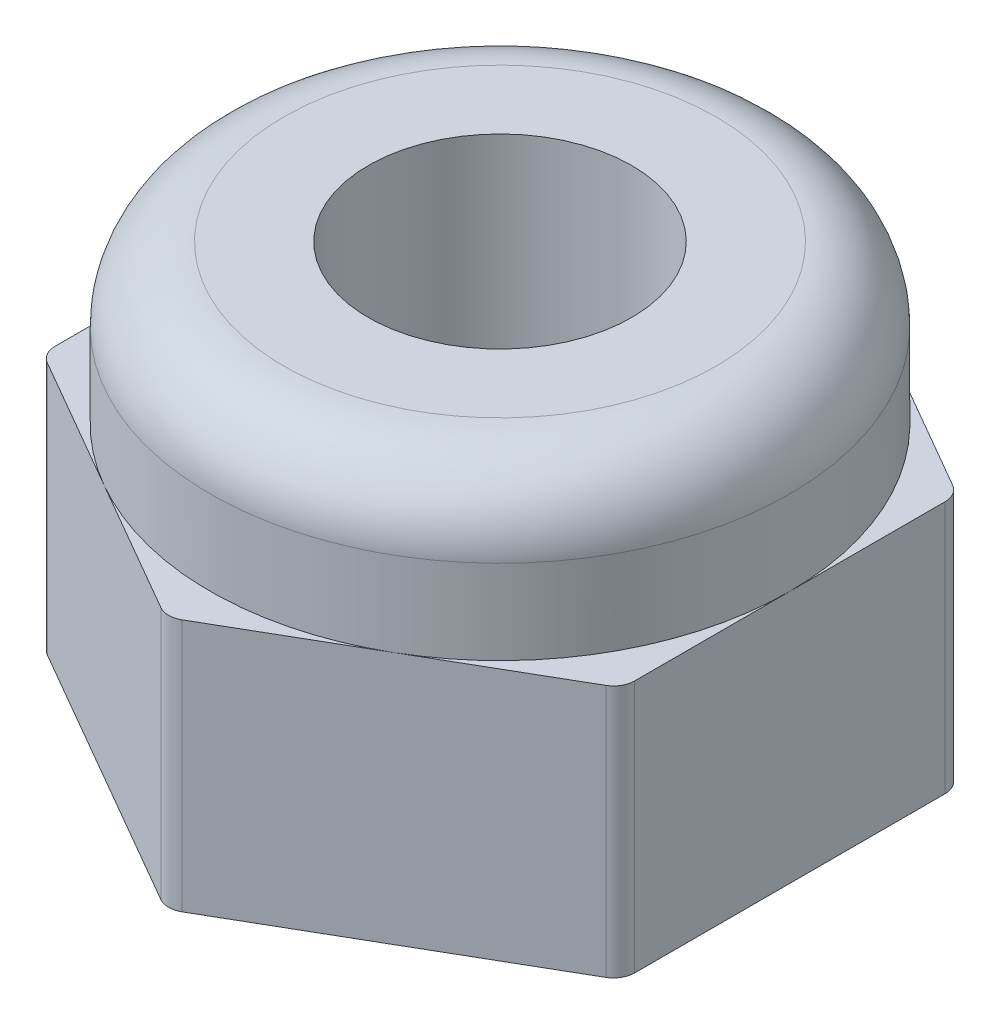
ISO-10303-21;
HEADER;
FILE_DESCRIPTION(('STEP AP214'),'2;1');
FILE_NAME('part.step','',(''),(''),'','','');
FILE_SCHEMA(('AUTOMOTIVE_DESIGN { 1 0 10303 214 1 1 1 1 }'));
ENDSEC;
DATA;
#1=APPLICATION_CONTEXT('core data for automotive mechanical design processes');
#2=APPLICATION_PROTOCOL_DEFINITION('international standard','automotive_design',2000,#1);
#3=PRODUCT_CONTEXT('',#1,'mechanical');
#4=PRODUCT('Part','Part','',(#3));
#5=PRODUCT_RELATED_PRODUCT_CATEGORY('part','',(#4));
#6=PRODUCT_DEFINITION_FORMATION('','',#4);
#7=PRODUCT_DEFINITION_CONTEXT('part definition',#1,'design');
#8=PRODUCT_DEFINITION('design','',#6,#7);
#9=PRODUCT_DEFINITION_SHAPE('','',#8);
#10=(LENGTH_UNIT() NAMED_UNIT(*) SI_UNIT(.MILLI.,.METRE.));
#11=(NAMED_UNIT(*) PLANE_ANGLE_UNIT() SI_UNIT($,.RADIAN.));
#12=(NAMED_UNIT(*) SI_UNIT($,.STERADIAN.) SOLID_ANGLE_UNIT());
#13=UNCERTAINTY_MEASURE_WITH_UNIT(LENGTH_MEASURE(1.E-05),#10,'distance_accuracy_value','');
#14=(GEOMETRIC_REPRESENTATION_CONTEXT(3) GLOBAL_UNCERTAINTY_ASSIGNED_CONTEXT((#13)) GLOBAL_UNIT_ASSIGNED_CONTEXT((#10,
#11,#12)) REPRESENTATION_CONTEXT('',''));
#15=CARTESIAN_POINT('',(0.,0.,0.));
#16=DIRECTION('',(0.,0.,1.));
#17=DIRECTION('',(1.,0.,0.));
#18=AXIS2_PLACEMENT_3D('',#15,#16,#17);
#19=CARTESIAN_POINT('',(0.,2.4,0.));
#20=DIRECTION('',(0.,1.,0.));
#21=DIRECTION('',(0.,0.,1.));
#22=AXIS2_PLACEMENT_3D('',#19,#20,#21);
#23=PLANE('',#22);
#24=DIRECTION('',(0.866025403784439,0.,-0.5));
#25=VECTOR('',#24,1.);
#26=CARTESIAN_POINT('',(0.,2.4,3.17542648054294));
#27=LINE('',#26,#25);
#28=CARTESIAN_POINT('',(1.375,2.4,2.38156986040721));
#29=VERTEX_POINT('',#28);
#30=CARTESIAN_POINT('',(2.65,2.4,1.64544826719043));
#31=VERTEX_POINT('',#30);
#32=EDGE_CURVE('E159',#29,#31,#27,.T.);
#33=ORIENTED_EDGE('',*,*,#32,.T.);
#34=CARTESIAN_POINT('',(2.55,2.4,1.47224318643355));
#35=DIRECTION('',(0.,1.,0.));
#36=DIRECTION('',(0.,0.,1.));
#37=AXIS2_PLACEMENT_3D('',#34,#35,#36);
#38=CIRCLE('',#37,0.2);
#39=CARTESIAN_POINT('',(2.75,2.4,1.47224318643355));
#40=VERTEX_POINT('',#39);
#41=EDGE_CURVE('E52',#31,#40,#38,.T.);
#42=ORIENTED_EDGE('',*,*,#41,.T.);
#43=DIRECTION('',(0.,0.,-1.));
#44=VECTOR('',#43,1.);
#45=CARTESIAN_POINT('',(2.75,2.4,1.58771324027147));
#46=LINE('',#45,#44);
#47=CARTESIAN_POINT('',(2.75,2.4,0.));
#48=VERTEX_POINT('',#47);
#49=EDGE_CURVE('E170',#40,#48,#46,.T.);
#50=ORIENTED_EDGE('',*,*,#49,.T.);
#51=CARTESIAN_POINT('',(0.,2.4,0.));
#52=DIRECTION('',(0.,1.,0.));
#53=DIRECTION('',(0.,0.,1.));
#54=AXIS2_PLACEMENT_3D('',#51,#52,#53);
#55=CIRCLE('',#54,2.75);
#56=EDGE_CURVE('E168',#29,#48,#55,.T.);
#57=ORIENTED_EDGE('',*,*,#56,.F.);
#58=EDGE_LOOP('',(#33,#42,#50,#57));
#59=FACE_BOUND('',#58,.T.);
#60=ADVANCED_FACE('F43',(#59),#23,.T.);
#61=CARTESIAN_POINT('',(2.75,2.4,-1.47224318643355));
#62=VERTEX_POINT('',#61);
#63=EDGE_CURVE('E158',#48,#62,#46,.T.);
#64=ORIENTED_EDGE('',*,*,#63,.T.);
#65=CARTESIAN_POINT('',(2.55,2.4,-1.47224318643355));
#66=DIRECTION('',(0.,1.,0.));
#67=DIRECTION('',(0.,0.,1.));
#68=AXIS2_PLACEMENT_3D('',#65,#66,#67);
#69=CIRCLE('',#68,0.2);
#70=CARTESIAN_POINT('',(2.65,2.4,-1.64544826719043));
#71=VERTEX_POINT('',#70);
#72=EDGE_CURVE('E302',#62,#71,#69,.T.);
#73=ORIENTED_EDGE('',*,*,#72,.T.);
#74=DIRECTION('',(-0.866025403784439,0.,-0.5));
#75=VECTOR('',#74,1.);
#76=CARTESIAN_POINT('',(2.75,2.4,-1.58771324027147));
#77=LINE('',#76,#75);
#78=CARTESIAN_POINT('',(1.375,2.4,-2.38156986040721));
#79=VERTEX_POINT('',#78);
#80=EDGE_CURVE('E193',#71,#79,#77,.T.);
#81=ORIENTED_EDGE('',*,*,#80,.T.);
#82=EDGE_CURVE('E176',#48,#79,#55,.T.);
#83=ORIENTED_EDGE('',*,*,#82,.F.);
#84=EDGE_LOOP('',(#64,#73,#81,#83));
#85=FACE_BOUND('',#84,.T.);
#86=ADVANCED_FACE('F366',(#85),#23,.T.);
#87=CARTESIAN_POINT('',(0.1,2.4,-3.11769145362398));
#88=VERTEX_POINT('',#87);
#89=EDGE_CURVE('E197',#79,#88,#77,.T.);
#90=ORIENTED_EDGE('',*,*,#89,.T.);
#91=CARTESIAN_POINT('',(0.,2.4,-2.94448637286709));
#92=DIRECTION('',(0.,1.,0.));
#93=DIRECTION('',(0.,0.,1.));
#94=AXIS2_PLACEMENT_3D('',#91,#92,#93);
#95=CIRCLE('',#94,0.2);
#96=CARTESIAN_POINT('',(-0.0999999999999989,2.4,-3.11769145362398));
#97=VERTEX_POINT('',#96);
#98=EDGE_CURVE('E292',#88,#97,#95,.T.);
#99=ORIENTED_EDGE('',*,*,#98,.T.);
#100=DIRECTION('',(-0.866025403784439,0.,0.5));
#101=VECTOR('',#100,1.);
#102=CARTESIAN_POINT('',(0.,2.4,-3.17542648054294));
#103=LINE('',#102,#101);
#104=CARTESIAN_POINT('',(-1.375,2.4,-2.38156986040721));
#105=VERTEX_POINT('',#104);
#106=EDGE_CURVE('E198',#97,#105,#103,.T.);
#107=ORIENTED_EDGE('',*,*,#106,.T.);
#108=EDGE_CURVE('E374',#79,#105,#55,.T.);
#109=ORIENTED_EDGE('',*,*,#108,.F.);
#110=EDGE_LOOP('',(#90,#99,#107,#109));
#111=FACE_BOUND('',#110,.T.);
#112=ADVANCED_FACE('F390',(#111),#23,.T.);
#113=CARTESIAN_POINT('',(-2.65,2.4,-1.64544826719043));
#114=VERTEX_POINT('',#113);
#115=EDGE_CURVE('E196',#105,#114,#103,.T.);
#116=ORIENTED_EDGE('',*,*,#115,.T.);
#117=CARTESIAN_POINT('',(-2.55,2.4,-1.47224318643355));
#118=DIRECTION('',(0.,1.,0.));
#119=DIRECTION('',(0.,0.,1.));
#120=AXIS2_PLACEMENT_3D('',#117,#118,#119);
#121=CIRCLE('',#120,0.2);
#122=CARTESIAN_POINT('',(-2.75,2.4,-1.47224318643355));
#123=VERTEX_POINT('',#122);
#124=EDGE_CURVE('E282',#114,#123,#121,.T.);
#125=ORIENTED_EDGE('',*,*,#124,.T.);
#126=DIRECTION('',(0.,0.,1.));
#127=VECTOR('',#126,1.);
#128=CARTESIAN_POINT('',(-2.75,2.4,-1.58771324027147));
#129=LINE('',#128,#127);
#130=CARTESIAN_POINT('',(-2.75,2.4,0.));
#131=VERTEX_POINT('',#130);
#132=EDGE_CURVE('E202',#123,#131,#129,.T.);
#133=ORIENTED_EDGE('',*,*,#132,.T.);
#134=EDGE_CURVE('E187',#105,#131,#55,.T.);
#135=ORIENTED_EDGE('',*,*,#134,.F.);
#136=EDGE_LOOP('',(#116,#125,#133,#135));
#137=FACE_BOUND('',#136,.T.);
#138=ADVANCED_FACE('F380',(#137),#23,.T.);
#139=CARTESIAN_POINT('',(-2.75,2.4,1.47224318643355));
#140=VERTEX_POINT('',#139);
#141=EDGE_CURVE('E201',#131,#140,#129,.T.);
#142=ORIENTED_EDGE('',*,*,#141,.T.);
#143=CARTESIAN_POINT('',(-2.55,2.4,1.47224318643355));
#144=DIRECTION('',(0.,1.,0.));
#145=DIRECTION('',(0.,0.,1.));
#146=AXIS2_PLACEMENT_3D('',#143,#144,#145);
#147=CIRCLE('',#146,0.2);
#148=CARTESIAN_POINT('',(-2.65,2.4,1.64544826719043));
#149=VERTEX_POINT('',#148);
#150=EDGE_CURVE('E272',#140,#149,#147,.T.);
#151=ORIENTED_EDGE('',*,*,#150,.T.);
#152=DIRECTION('',(0.866025403784439,0.,0.5));
#153=VECTOR('',#152,1.);
#154=CARTESIAN_POINT('',(-2.75,2.4,1.58771324027147));
#155=LINE('',#154,#153);
#156=CARTESIAN_POINT('',(-1.375,2.4,2.38156986040721));
#157=VERTEX_POINT('',#156);
#158=EDGE_CURVE('E166',#149,#157,#155,.T.);
#159=ORIENTED_EDGE('',*,*,#158,.T.);
#160=EDGE_CURVE('E182',#131,#157,#55,.T.);
#161=ORIENTED_EDGE('',*,*,#160,.F.);
#162=EDGE_LOOP('',(#142,#151,#159,#161));
#163=FACE_BOUND('',#162,.T.);
#164=ADVANCED_FACE('F382',(#163),#23,.T.);
#165=CARTESIAN_POINT('',(2.75,2.4,-1.58771324027147));
#166=DIRECTION('',(-0.5,0.,0.866025403784439));
#167=DIRECTION('',(0.866025403784439,0.,0.5));
#168=AXIS2_PLACEMENT_3D('',#165,#166,#167);
#169=PLANE('',#168);
#170=DIRECTION('',(-0.866025403784439,0.,-0.5));
#171=VECTOR('',#170,1.);
#172=CARTESIAN_POINT('',(2.75,0.,-1.58771324027147));
#173=LINE('',#172,#171);
#174=CARTESIAN_POINT('',(2.65,0.,-1.64544826719043));
#175=VERTEX_POINT('',#174);
#176=CARTESIAN_POINT('',(0.1,0.,-3.11769145362398));
#177=VERTEX_POINT('',#176);
#178=EDGE_CURVE('E175',#175,#177,#173,.T.);
#179=ORIENTED_EDGE('',*,*,#178,.T.);
#180=DIRECTION('',(0.,-1.,0.));
#181=VECTOR('',#180,1.);
#182=CARTESIAN_POINT('',(0.100000000000001,2.4,-3.11769145362398));
#183=LINE('',#182,#181);
#184=EDGE_CURVE('E289',#177,#88,#183,.F.);
#185=ORIENTED_EDGE('',*,*,#184,.T.);
#186=ORIENTED_EDGE('',*,*,#89,.F.);
#187=ORIENTED_EDGE('',*,*,#80,.F.);
#188=DIRECTION('',(0.,-1.,0.));
#189=VECTOR('',#188,1.);
#190=CARTESIAN_POINT('',(2.65,2.4,-1.64544826719043));
#191=LINE('',#190,#189);
#192=EDGE_CURVE('E285',#71,#175,#191,.T.);
#193=ORIENTED_EDGE('',*,*,#192,.T.);
#194=EDGE_LOOP('',(#179,#185,#186,#187,#193));
#195=FACE_BOUND('',#194,.T.);
#196=ADVANCED_FACE('F356',(#195),#169,.F.);
#197=CARTESIAN_POINT('',(0.,2.4,-3.17542648054294));
#198=DIRECTION('',(0.5,0.,0.866025403784439));
#199=DIRECTION('',(0.866025403784439,0.,-0.5));
#200=AXIS2_PLACEMENT_3D('',#197,#198,#199);
#201=PLANE('',#200);
#202=DIRECTION('',(-0.866025403784439,0.,0.5));
#203=VECTOR('',#202,1.);
#204=CARTESIAN_POINT('',(0.,0.,-3.17542648054294));
#205=LINE('',#204,#203);
#206=CARTESIAN_POINT('',(-0.0999999999999989,0.,-3.11769145362398));
#207=VERTEX_POINT('',#206);
#208=CARTESIAN_POINT('',(-2.65,0.,-1.64544826719043));
#209=VERTEX_POINT('',#208);
#210=EDGE_CURVE('E214',#207,#209,#205,.T.);
#211=ORIENTED_EDGE('',*,*,#210,.T.);
#212=DIRECTION('',(0.,-1.,0.));
#213=VECTOR('',#212,1.);
#214=CARTESIAN_POINT('',(-2.65,2.4,-1.64544826719043));
#215=LINE('',#214,#213);
#216=EDGE_CURVE('E279',#209,#114,#215,.F.);
#217=ORIENTED_EDGE('',*,*,#216,.T.);
#218=ORIENTED_EDGE('',*,*,#115,.F.);
#219=ORIENTED_EDGE('',*,*,#106,.F.);
#220=DIRECTION('',(0.,-1.,0.));
#221=VECTOR('',#220,1.);
#222=CARTESIAN_POINT('',(-0.0999999999999989,2.4,-3.11769145362398));
#223=LINE('',#222,#221);
#224=EDGE_CURVE('E275',#97,#207,#223,.T.);
#225=ORIENTED_EDGE('',*,*,#224,.T.);
#226=EDGE_LOOP('',(#211,#217,#218,#219,#225));
#227=FACE_BOUND('',#226,.T.);
#228=ADVANCED_FACE('F345',(#227),#201,.F.);
#229=CARTESIAN_POINT('',(-2.75,2.4,-1.58771324027147));
#230=DIRECTION('',(1.,0.,0.));
#231=DIRECTION('',(0.,0.,-1.));
#232=AXIS2_PLACEMENT_3D('',#229,#230,#231);
#233=PLANE('',#232);
#234=DIRECTION('',(0.,0.,1.));
#235=VECTOR('',#234,1.);
#236=CARTESIAN_POINT('',(-2.75,0.,-1.58771324027147));
#237=LINE('',#236,#235);
#238=CARTESIAN_POINT('',(-2.75,0.,-1.47224318643355));
#239=VERTEX_POINT('',#238);
#240=CARTESIAN_POINT('',(-2.75,0.,1.47224318643355));
#241=VERTEX_POINT('',#240);
#242=EDGE_CURVE('E218',#239,#241,#237,.T.);
#243=ORIENTED_EDGE('',*,*,#242,.T.);
#244=DIRECTION('',(0.,-1.,0.));
#245=VECTOR('',#244,1.);
#246=CARTESIAN_POINT('',(-2.75,2.4,1.47224318643355));
#247=LINE('',#246,#245);
#248=EDGE_CURVE('E269',#241,#140,#247,.F.);
#249=ORIENTED_EDGE('',*,*,#248,.T.);
#250=ORIENTED_EDGE('',*,*,#141,.F.);
#251=ORIENTED_EDGE('',*,*,#132,.F.);
#252=DIRECTION('',(0.,-1.,0.));
#253=VECTOR('',#252,1.);
#254=CARTESIAN_POINT('',(-2.75,2.4,-1.47224318643355));
#255=LINE('',#254,#253);
#256=EDGE_CURVE('E265',#123,#239,#255,.T.);
#257=ORIENTED_EDGE('',*,*,#256,.T.);
#258=EDGE_LOOP('',(#243,#249,#250,#251,#257));
#259=FACE_BOUND('',#258,.T.);
#260=ADVANCED_FACE('F334',(#259),#233,.F.);
#261=CARTESIAN_POINT('',(-2.75,2.4,1.58771324027147));
#262=DIRECTION('',(0.5,0.,-0.866025403784439));
#263=DIRECTION('',(-0.866025403784439,0.,-0.5));
#264=AXIS2_PLACEMENT_3D('',#261,#262,#263);
#265=PLANE('',#264);
#266=ORIENTED_EDGE('',*,*,#158,.F.);
#267=DIRECTION('',(0.,-1.,0.));
#268=VECTOR('',#267,1.);
#269=CARTESIAN_POINT('',(-2.65,2.4,1.64544826719043));
#270=LINE('',#269,#268);
#271=CARTESIAN_POINT('',(-2.65,0.,1.64544826719043));
#272=VERTEX_POINT('',#271);
#273=EDGE_CURVE('E243',#149,#272,#270,.T.);
#274=ORIENTED_EDGE('',*,*,#273,.T.);
#275=DIRECTION('',(0.866025403784439,0.,0.5));
#276=VECTOR('',#275,1.);
#277=CARTESIAN_POINT('',(-2.75,0.,1.58771324027147));
#278=LINE('',#277,#276);
#279=CARTESIAN_POINT('',(-0.100000000000001,0.,3.11769145362398));
#280=VERTEX_POINT('',#279);
#281=EDGE_CURVE('E222',#272,#280,#278,.T.);
#282=ORIENTED_EDGE('',*,*,#281,.T.);
#283=DIRECTION('',(0.,-1.,0.));
#284=VECTOR('',#283,1.);
#285=CARTESIAN_POINT('',(-0.100000000000001,2.4,3.11769145362398));
#286=LINE('',#285,#284);
#287=CARTESIAN_POINT('',(-0.100000000000001,2.4,3.11769145362398));
#288=VERTEX_POINT('',#287);
#289=EDGE_CURVE('E240',#280,#288,#286,.F.);
#290=ORIENTED_EDGE('',*,*,#289,.T.);
#291=EDGE_CURVE('E205',#157,#288,#155,.T.);
#292=ORIENTED_EDGE('',*,*,#291,.F.);
#293=EDGE_LOOP('',(#266,#274,#282,#290,#292));
#294=FACE_BOUND('',#293,.T.);
#295=ADVANCED_FACE('F326',(#294),#265,.F.);
#296=CARTESIAN_POINT('',(0.,2.4,3.17542648054294));
#297=DIRECTION('',(-0.5,0.,-0.866025403784439));
#298=DIRECTION('',(-0.866025403784439,0.,0.5));
#299=AXIS2_PLACEMENT_3D('',#296,#297,#298);
#300=PLANE('',#299);
#301=DIRECTION('',(0.866025403784439,0.,-0.5));
#302=VECTOR('',#301,1.);
#303=CARTESIAN_POINT('',(0.,0.,3.17542648054294));
#304=LINE('',#303,#302);
#305=CARTESIAN_POINT('',(0.0999999999999995,0.,3.11769145362398));
#306=VERTEX_POINT('',#305);
#307=CARTESIAN_POINT('',(2.65,0.,1.64544826719043));
#308=VERTEX_POINT('',#307);
#309=EDGE_CURVE('E226',#306,#308,#304,.T.);
#310=ORIENTED_EDGE('',*,*,#309,.T.);
#311=DIRECTION('',(0.,-1.,0.));
#312=VECTOR('',#311,1.);
#313=CARTESIAN_POINT('',(2.65,2.4,1.64544826719043));
#314=LINE('',#313,#312);
#315=EDGE_CURVE('E65',#308,#31,#314,.F.);
#316=ORIENTED_EDGE('',*,*,#315,.T.);
#317=ORIENTED_EDGE('',*,*,#32,.F.);
#318=CARTESIAN_POINT('',(0.0999999999999995,2.4,3.11769145362398));
#319=VERTEX_POINT('',#318);
#320=EDGE_CURVE('E150',#319,#29,#27,.T.);
#321=ORIENTED_EDGE('',*,*,#320,.F.);
#322=DIRECTION('',(0.,-1.,0.));
#323=VECTOR('',#322,1.);
#324=CARTESIAN_POINT('',(0.0999999999999995,2.4,3.11769145362398));
#325=LINE('',#324,#323);
#326=EDGE_CURVE('E305',#319,#306,#325,.T.);
#327=ORIENTED_EDGE('',*,*,#326,.T.);
#328=EDGE_LOOP('',(#310,#316,#317,#321,#327));
#329=FACE_BOUND('',#328,.T.);
#330=ADVANCED_FACE('F162',(#329),#300,.F.);
#331=CARTESIAN_POINT('',(2.75,2.4,1.58771324027147));
#332=DIRECTION('',(-1.,0.,0.));
#333=DIRECTION('',(0.,0.,1.));
#334=AXIS2_PLACEMENT_3D('',#331,#332,#333);
#335=PLANE('',#334);
#336=DIRECTION('',(0.,0.,-1.));
#337=VECTOR('',#336,1.);
#338=CARTESIAN_POINT('',(2.75,0.,1.58771324027147));
#339=LINE('',#338,#337);
#340=CARTESIAN_POINT('',(2.75,0.,1.47224318643355));
#341=VERTEX_POINT('',#340);
#342=CARTESIAN_POINT('',(2.75,0.,-1.47224318643355));
#343=VERTEX_POINT('',#342);
#344=EDGE_CURVE('E229',#341,#343,#339,.T.);
#345=ORIENTED_EDGE('',*,*,#344,.T.);
#346=DIRECTION('',(0.,-1.,0.));
#347=VECTOR('',#346,1.);
#348=CARTESIAN_POINT('',(2.75,2.4,-1.47224318643355));
#349=LINE('',#348,#347);
#350=EDGE_CURVE('E299',#343,#62,#349,.F.);
#351=ORIENTED_EDGE('',*,*,#350,.T.);
#352=ORIENTED_EDGE('',*,*,#63,.F.);
#353=ORIENTED_EDGE('',*,*,#49,.F.);
#354=DIRECTION('',(0.,-1.,0.));
#355=VECTOR('',#354,1.);
#356=CARTESIAN_POINT('',(2.75,2.4,1.47224318643355));
#357=LINE('',#356,#355);
#358=EDGE_CURVE('E295',#40,#341,#357,.T.);
#359=ORIENTED_EDGE('',*,*,#358,.T.);
#360=EDGE_LOOP('',(#345,#351,#352,#353,#359));
#361=FACE_BOUND('',#360,.T.);
#362=ADVANCED_FACE('F314',(#361),#335,.F.);
#363=ORIENTED_EDGE('',*,*,#291,.T.);
#364=CARTESIAN_POINT('',(0.,2.4,2.94448637286709));
#365=DIRECTION('',(0.,1.,0.));
#366=DIRECTION('',(0.,0.,1.));
#367=AXIS2_PLACEMENT_3D('',#364,#365,#366);
#368=CIRCLE('',#367,0.2);
#369=EDGE_CURVE('E11',#288,#319,#368,.T.);
#370=ORIENTED_EDGE('',*,*,#369,.T.);
#371=ORIENTED_EDGE('',*,*,#320,.T.);
#372=EDGE_CURVE('E153',#157,#29,#55,.T.);
#373=ORIENTED_EDGE('',*,*,#372,.F.);
#374=EDGE_LOOP('',(#363,#370,#371,#373));
#375=FACE_BOUND('',#374,.T.);
#376=ADVANCED_FACE('F151',(#375),#23,.T.);
#377=CARTESIAN_POINT('',(0.,0.,0.));
#378=DIRECTION('',(0.,1.,0.));
#379=DIRECTION('',(0.,0.,1.));
#380=AXIS2_PLACEMENT_3D('',#377,#378,#379);
#381=PLANE('',#380);
#382=CARTESIAN_POINT('',(0.,0.,0.));
#383=DIRECTION('',(0.,-1.,0.));
#384=DIRECTION('',(0.,0.,-1.));
#385=AXIS2_PLACEMENT_3D('',#382,#383,#384);
#386=CIRCLE('',#385,1.25);
#387=CARTESIAN_POINT('',(0.,0.,-1.25));
#388=VERTEX_POINT('',#387);
#389=EDGE_CURVE('E189',#388,#388,#386,.T.);
#390=ORIENTED_EDGE('',*,*,#389,.F.);
#391=EDGE_LOOP('',(#390));
#392=FACE_BOUND('',#391,.T.);
#393=ORIENTED_EDGE('',*,*,#281,.F.);
#394=CARTESIAN_POINT('',(-2.55,0.,1.47224318643355));
#395=DIRECTION('',(0.,1.,0.));
#396=DIRECTION('',(0.,0.,1.));
#397=AXIS2_PLACEMENT_3D('',#394,#395,#396);
#398=CIRCLE('',#397,0.2);
#399=EDGE_CURVE('E262',#272,#241,#398,.F.);
#400=ORIENTED_EDGE('',*,*,#399,.T.);
#401=ORIENTED_EDGE('',*,*,#242,.F.);
#402=CARTESIAN_POINT('',(-2.55,0.,-1.47224318643355));
#403=DIRECTION('',(0.,1.,0.));
#404=DIRECTION('',(0.,0.,1.));
#405=AXIS2_PLACEMENT_3D('',#402,#403,#404);
#406=CIRCLE('',#405,0.2);
#407=EDGE_CURVE('E259',#239,#209,#406,.F.);
#408=ORIENTED_EDGE('',*,*,#407,.T.);
#409=ORIENTED_EDGE('',*,*,#210,.F.);
#410=CARTESIAN_POINT('',(0.,0.,-2.94448637286709));
#411=DIRECTION('',(0.,1.,0.));
#412=DIRECTION('',(0.,0.,1.));
#413=AXIS2_PLACEMENT_3D('',#410,#411,#412);
#414=CIRCLE('',#413,0.2);
#415=EDGE_CURVE('E256',#207,#177,#414,.F.);
#416=ORIENTED_EDGE('',*,*,#415,.T.);
#417=ORIENTED_EDGE('',*,*,#178,.F.);
#418=CARTESIAN_POINT('',(2.55,0.,-1.47224318643355));
#419=DIRECTION('',(0.,1.,0.));
#420=DIRECTION('',(0.,0.,1.));
#421=AXIS2_PLACEMENT_3D('',#418,#419,#420);
#422=CIRCLE('',#421,0.2);
#423=EDGE_CURVE('E253',#175,#343,#422,.F.);
#424=ORIENTED_EDGE('',*,*,#423,.T.);
#425=ORIENTED_EDGE('',*,*,#344,.F.);
#426=CARTESIAN_POINT('',(2.55,0.,1.47224318643355));
#427=DIRECTION('',(0.,1.,0.));
#428=DIRECTION('',(0.,0.,1.));
#429=AXIS2_PLACEMENT_3D('',#426,#427,#428);
#430=CIRCLE('',#429,0.2);
#431=EDGE_CURVE('E250',#341,#308,#430,.F.);
#432=ORIENTED_EDGE('',*,*,#431,.T.);
#433=ORIENTED_EDGE('',*,*,#309,.F.);
#434=CARTESIAN_POINT('',(0.,0.,2.94448637286709));
#435=DIRECTION('',(0.,1.,0.));
#436=DIRECTION('',(0.,0.,1.));
#437=AXIS2_PLACEMENT_3D('',#434,#435,#436);
#438=CIRCLE('',#437,0.2);
#439=EDGE_CURVE('E247',#306,#280,#438,.F.);
#440=ORIENTED_EDGE('',*,*,#439,.T.);
#441=EDGE_LOOP('',(#393,#400,#401,#408,#409,#416,#417,#424,#425,#432,#433,#440));
#442=FACE_BOUND('',#441,.T.);
#443=ADVANCED_FACE('F321',(#392,#442),#381,.F.);
#444=CARTESIAN_POINT('',(0.,3.9,0.));
#445=DIRECTION('',(0.,-1.,0.));
#446=DIRECTION('',(0.,0.,-1.));
#447=AXIS2_PLACEMENT_3D('',#444,#445,#446);
#448=CYLINDRICAL_SURFACE('',#447,2.75);
#449=CARTESIAN_POINT('',(0.,3.2,0.));
#450=DIRECTION('',(0.,-1.,0.));
#451=DIRECTION('',(0.,0.,-1.));
#452=AXIS2_PLACEMENT_3D('',#449,#450,#451);
#453=CIRCLE('',#452,2.75);
#454=CARTESIAN_POINT('',(0.,3.2,-2.75));
#455=VERTEX_POINT('',#454);
#456=EDGE_CURVE('E210',#455,#455,#453,.T.);
#457=ORIENTED_EDGE('',*,*,#456,.T.);
#458=EDGE_LOOP('',(#457));
#459=FACE_BOUND('',#458,.T.);
#460=ORIENTED_EDGE('',*,*,#372,.T.);
#461=ORIENTED_EDGE('',*,*,#56,.T.);
#462=ORIENTED_EDGE('',*,*,#82,.T.);
#463=ORIENTED_EDGE('',*,*,#108,.T.);
#464=ORIENTED_EDGE('',*,*,#134,.T.);
#465=ORIENTED_EDGE('',*,*,#160,.T.);
#466=EDGE_LOOP('',(#460,#461,#462,#463,#464,#465));
#467=FACE_BOUND('',#466,.T.);
#468=ADVANCED_FACE('F179',(#459,#467),#448,.T.);
#469=CARTESIAN_POINT('',(0.,3.9,0.));
#470=DIRECTION('',(0.,-1.,0.));
#471=DIRECTION('',(0.,0.,-1.));
#472=AXIS2_PLACEMENT_3D('',#469,#470,#471);
#473=PLANE('',#472);
#474=CARTESIAN_POINT('',(0.,3.9,0.));
#475=DIRECTION('',(0.,-1.,0.));
#476=DIRECTION('',(0.,0.,-1.));
#477=AXIS2_PLACEMENT_3D('',#474,#475,#476);
#478=CIRCLE('',#477,1.25);
#479=CARTESIAN_POINT('',(0.,3.9,-1.25));
#480=VERTEX_POINT('',#479);
#481=EDGE_CURVE('E184',#480,#480,#478,.T.);
#482=ORIENTED_EDGE('',*,*,#481,.T.);
#483=EDGE_LOOP('',(#482));
#484=FACE_BOUND('',#483,.T.);
#485=CARTESIAN_POINT('',(0.,3.9,0.));
#486=DIRECTION('',(0.,-1.,0.));
#487=DIRECTION('',(0.,0.,-1.));
#488=AXIS2_PLACEMENT_3D('',#485,#486,#487);
#489=CIRCLE('',#488,2.05);
#490=CARTESIAN_POINT('',(0.,3.9,-2.05));
#491=VERTEX_POINT('',#490);
#492=EDGE_CURVE('E236',#491,#491,#489,.F.);
#493=ORIENTED_EDGE('',*,*,#492,.T.);
#494=EDGE_LOOP('',(#493));
#495=FACE_BOUND('',#494,.T.);
#496=ADVANCED_FACE('F531',(#484,#495),#473,.F.);
#497=CARTESIAN_POINT('',(0.,3.2,0.));
#498=DIRECTION('',(0.,-1.,0.));
#499=DIRECTION('',(0.,0.,-1.));
#500=AXIS2_PLACEMENT_3D('',#497,#498,#499);
#501=TOROIDAL_SURFACE('',#500,2.05,0.7);
#502=ORIENTED_EDGE('',*,*,#492,.F.);
#503=EDGE_LOOP('',(#502));
#504=FACE_BOUND('',#503,.T.);
#505=ORIENTED_EDGE('',*,*,#456,.F.);
#506=EDGE_LOOP('',(#505));
#507=FACE_BOUND('',#506,.T.);
#508=ADVANCED_FACE('F475',(#504,#507),#501,.T.);
#509=CARTESIAN_POINT('',(-2.55,2.4,1.47224318643355));
#510=DIRECTION('',(0.,-1.,0.));
#511=DIRECTION('',(0.,0.,-1.));
#512=AXIS2_PLACEMENT_3D('',#509,#510,#511);
#513=CYLINDRICAL_SURFACE('',#512,0.2);
#514=ORIENTED_EDGE('',*,*,#150,.F.);
#515=ORIENTED_EDGE('',*,*,#248,.F.);
#516=ORIENTED_EDGE('',*,*,#399,.F.);
#517=ORIENTED_EDGE('',*,*,#273,.F.);
#518=EDGE_LOOP('',(#514,#515,#516,#517));
#519=FACE_BOUND('',#518,.T.);
#520=ADVANCED_FACE('F330',(#519),#513,.T.);
#521=CARTESIAN_POINT('',(-2.55,2.4,-1.47224318643355));
#522=DIRECTION('',(0.,-1.,0.));
#523=DIRECTION('',(0.,0.,-1.));
#524=AXIS2_PLACEMENT_3D('',#521,#522,#523);
#525=CYLINDRICAL_SURFACE('',#524,0.2);
#526=ORIENTED_EDGE('',*,*,#124,.F.);
#527=ORIENTED_EDGE('',*,*,#216,.F.);
#528=ORIENTED_EDGE('',*,*,#407,.F.);
#529=ORIENTED_EDGE('',*,*,#256,.F.);
#530=EDGE_LOOP('',(#526,#527,#528,#529));
#531=FACE_BOUND('',#530,.T.);
#532=ADVANCED_FACE('F341',(#531),#525,.T.);
#533=CARTESIAN_POINT('',(0.,2.4,-2.94448637286709));
#534=DIRECTION('',(0.,-1.,0.));
#535=DIRECTION('',(0.,0.,-1.));
#536=AXIS2_PLACEMENT_3D('',#533,#534,#535);
#537=CYLINDRICAL_SURFACE('',#536,0.2);
#538=ORIENTED_EDGE('',*,*,#98,.F.);
#539=ORIENTED_EDGE('',*,*,#184,.F.);
#540=ORIENTED_EDGE('',*,*,#415,.F.);
#541=ORIENTED_EDGE('',*,*,#224,.F.);
#542=EDGE_LOOP('',(#538,#539,#540,#541));
#543=FACE_BOUND('',#542,.T.);
#544=ADVANCED_FACE('F352',(#543),#537,.T.);
#545=CARTESIAN_POINT('',(2.55,2.4,-1.47224318643355));
#546=DIRECTION('',(0.,-1.,0.));
#547=DIRECTION('',(0.,0.,-1.));
#548=AXIS2_PLACEMENT_3D('',#545,#546,#547);
#549=CYLINDRICAL_SURFACE('',#548,0.2);
#550=ORIENTED_EDGE('',*,*,#72,.F.);
#551=ORIENTED_EDGE('',*,*,#350,.F.);
#552=ORIENTED_EDGE('',*,*,#423,.F.);
#553=ORIENTED_EDGE('',*,*,#192,.F.);
#554=EDGE_LOOP('',(#550,#551,#552,#553));
#555=FACE_BOUND('',#554,.T.);
#556=ADVANCED_FACE('F363',(#555),#549,.T.);
#557=CARTESIAN_POINT('',(2.55,2.4,1.47224318643355));
#558=DIRECTION('',(0.,-1.,0.));
#559=DIRECTION('',(0.,0.,-1.));
#560=AXIS2_PLACEMENT_3D('',#557,#558,#559);
#561=CYLINDRICAL_SURFACE('',#560,0.2);
#562=ORIENTED_EDGE('',*,*,#41,.F.);
#563=ORIENTED_EDGE('',*,*,#315,.F.);
#564=ORIENTED_EDGE('',*,*,#431,.F.);
#565=ORIENTED_EDGE('',*,*,#358,.F.);
#566=EDGE_LOOP('',(#562,#563,#564,#565));
#567=FACE_BOUND('',#566,.T.);
#568=ADVANCED_FACE('F317',(#567),#561,.T.);
#569=CARTESIAN_POINT('',(0.,2.4,2.94448637286709));
#570=DIRECTION('',(0.,-1.,0.));
#571=DIRECTION('',(0.,0.,-1.));
#572=AXIS2_PLACEMENT_3D('',#569,#570,#571);
#573=CYLINDRICAL_SURFACE('',#572,0.2);
#574=ORIENTED_EDGE('',*,*,#369,.F.);
#575=ORIENTED_EDGE('',*,*,#289,.F.);
#576=ORIENTED_EDGE('',*,*,#439,.F.);
#577=ORIENTED_EDGE('',*,*,#326,.F.);
#578=EDGE_LOOP('',(#574,#575,#576,#577));
#579=FACE_BOUND('',#578,.T.);
#580=ADVANCED_FACE('F45',(#579),#573,.T.);
#581=CARTESIAN_POINT('',(0.,0.,0.));
#582=DIRECTION('',(0.,-1.,0.));
#583=DIRECTION('',(0.,0.,-1.));
#584=AXIS2_PLACEMENT_3D('',#581,#582,#583);
#585=CYLINDRICAL_SURFACE('',#584,1.25);
#586=ORIENTED_EDGE('',*,*,#389,.T.);
#587=EDGE_LOOP('',(#586));
#588=FACE_BOUND('',#587,.T.);
#589=ORIENTED_EDGE('',*,*,#481,.F.);
#590=EDGE_LOOP('',(#589));
#591=FACE_BOUND('',#590,.T.);
#592=ADVANCED_FACE('F517',(#588,#591),#585,.F.);
#593=CLOSED_SHELL('',(#60,#86,#112,#138,#164,#196,#228,#260,#295,#330,#362,#376,#443,#468,#496,
#508,#520,#532,#544,#556,#568,#580,#592));
#594=MANIFOLD_SOLID_BREP('B2',#593);
#595=ADVANCED_BREP_SHAPE_REPRESENTATION('',(#18,#594),#14);
#596=SHAPE_DEFINITION_REPRESENTATION(#9,#595);
ENDSEC;
END-ISO-10303-21;
